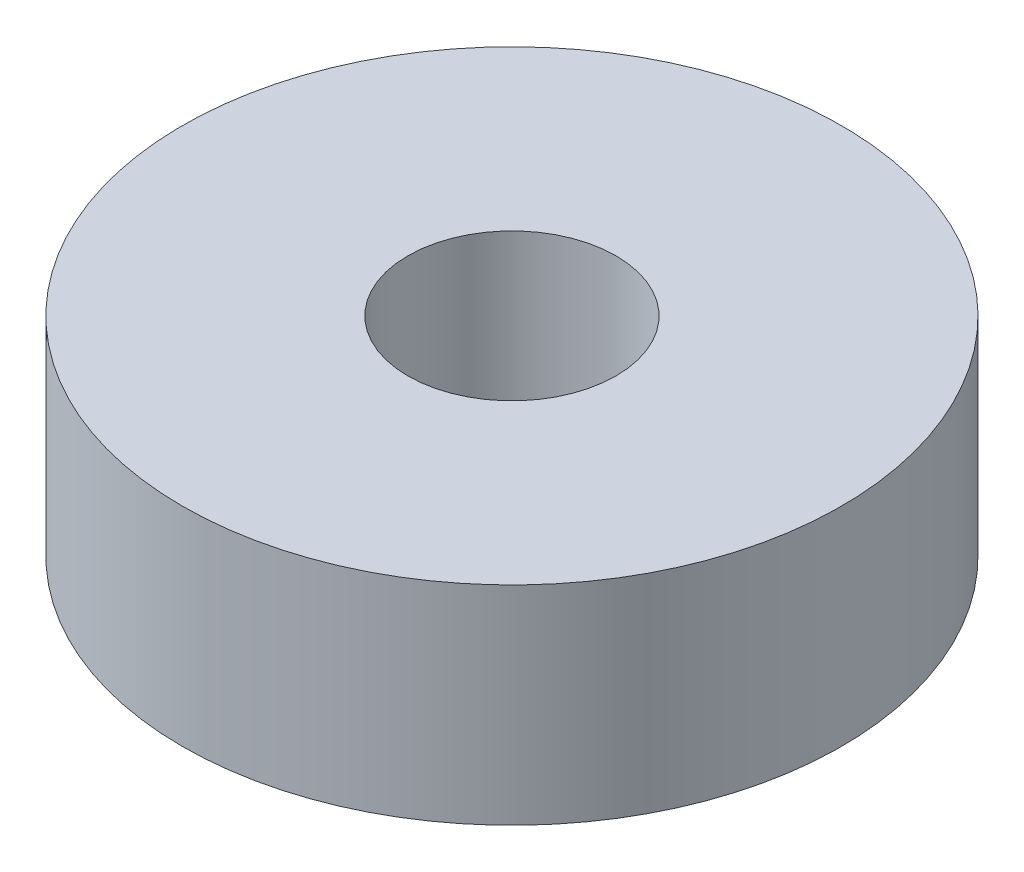
ISO-10303-21;
HEADER;
FILE_DESCRIPTION(('STEP AP214'),'2;1');
FILE_NAME('part.step','',(''),(''),'','','');
FILE_SCHEMA(('AUTOMOTIVE_DESIGN { 1 0 10303 214 1 1 1 1 }'));
ENDSEC;
DATA;
#1=APPLICATION_CONTEXT('core data for automotive mechanical design processes');
#2=APPLICATION_PROTOCOL_DEFINITION('international standard','automotive_design',2000,#1);
#3=PRODUCT_CONTEXT('',#1,'mechanical');
#4=PRODUCT('Part','Part','',(#3));
#5=PRODUCT_RELATED_PRODUCT_CATEGORY('part','',(#4));
#6=PRODUCT_DEFINITION_FORMATION('','',#4);
#7=PRODUCT_DEFINITION_CONTEXT('part definition',#1,'design');
#8=PRODUCT_DEFINITION('design','',#6,#7);
#9=PRODUCT_DEFINITION_SHAPE('','',#8);
#10=(LENGTH_UNIT() NAMED_UNIT(*) SI_UNIT(.MILLI.,.METRE.));
#11=(NAMED_UNIT(*) PLANE_ANGLE_UNIT() SI_UNIT($,.RADIAN.));
#12=(NAMED_UNIT(*) SI_UNIT($,.STERADIAN.) SOLID_ANGLE_UNIT());
#13=UNCERTAINTY_MEASURE_WITH_UNIT(LENGTH_MEASURE(1.E-05),#10,'distance_accuracy_value','');
#14=(GEOMETRIC_REPRESENTATION_CONTEXT(3) GLOBAL_UNCERTAINTY_ASSIGNED_CONTEXT((#13)) GLOBAL_UNIT_ASSIGNED_CONTEXT((#10,
#11,#12)) REPRESENTATION_CONTEXT('',''));
#15=CARTESIAN_POINT('',(0.,0.,0.));
#16=DIRECTION('',(0.,0.,1.));
#17=DIRECTION('',(1.,0.,0.));
#18=AXIS2_PLACEMENT_3D('',#15,#16,#17);
#19=CARTESIAN_POINT('',(0.,6.,0.));
#20=DIRECTION('',(0.,1.,0.));
#21=DIRECTION('',(0.,0.,1.));
#22=AXIS2_PLACEMENT_3D('',#19,#20,#21);
#23=PLANE('',#22);
#24=CARTESIAN_POINT('',(0.,6.,0.));
#25=DIRECTION('',(0.,1.,0.));
#26=DIRECTION('',(0.,0.,1.));
#27=AXIS2_PLACEMENT_3D('',#24,#25,#26);
#28=CIRCLE('',#27,9.5);
#29=CARTESIAN_POINT('',(0.,6.,9.5));
#30=VERTEX_POINT('',#29);
#31=EDGE_CURVE('E10',#30,#30,#28,.T.);
#32=ORIENTED_EDGE('',*,*,#31,.T.);
#33=EDGE_LOOP('',(#32));
#34=FACE_BOUND('',#33,.T.);
#35=CARTESIAN_POINT('',(0.,6.,0.));
#36=DIRECTION('',(0.,1.,0.));
#37=DIRECTION('',(0.,0.,1.));
#38=AXIS2_PLACEMENT_3D('',#35,#36,#37);
#39=CIRCLE('',#38,3.);
#40=CARTESIAN_POINT('',(0.,6.,3.));
#41=VERTEX_POINT('',#40);
#42=EDGE_CURVE('E43',#41,#41,#39,.T.);
#43=ORIENTED_EDGE('',*,*,#42,.F.);
#44=EDGE_LOOP('',(#43));
#45=FACE_BOUND('',#44,.T.);
#46=ADVANCED_FACE('F32',(#34,#45),#23,.T.);
#47=CARTESIAN_POINT('',(0.,0.,0.));
#48=DIRECTION('',(0.,1.,0.));
#49=DIRECTION('',(0.,0.,1.));
#50=AXIS2_PLACEMENT_3D('',#47,#48,#49);
#51=PLANE('',#50);
#52=CARTESIAN_POINT('',(0.,0.,0.));
#53=DIRECTION('',(0.,1.,0.));
#54=DIRECTION('',(0.,0.,1.));
#55=AXIS2_PLACEMENT_3D('',#52,#53,#54);
#56=CIRCLE('',#55,9.5);
#57=CARTESIAN_POINT('',(0.,0.,9.5));
#58=VERTEX_POINT('',#57);
#59=EDGE_CURVE('E36',#58,#58,#56,.T.);
#60=ORIENTED_EDGE('',*,*,#59,.F.);
#61=EDGE_LOOP('',(#60));
#62=FACE_BOUND('',#61,.T.);
#63=CARTESIAN_POINT('',(0.,0.,0.));
#64=DIRECTION('',(0.,1.,0.));
#65=DIRECTION('',(0.,0.,1.));
#66=AXIS2_PLACEMENT_3D('',#63,#64,#65);
#67=CIRCLE('',#66,3.);
#68=CARTESIAN_POINT('',(0.,0.,3.));
#69=VERTEX_POINT('',#68);
#70=EDGE_CURVE('E45',#69,#69,#67,.T.);
#71=ORIENTED_EDGE('',*,*,#70,.T.);
#72=EDGE_LOOP('',(#71));
#73=FACE_BOUND('',#72,.T.);
#74=ADVANCED_FACE('F55',(#62,#73),#51,.F.);
#75=CARTESIAN_POINT('',(0.,6.,0.));
#76=DIRECTION('',(0.,-1.,0.));
#77=DIRECTION('',(0.,0.,-1.));
#78=AXIS2_PLACEMENT_3D('',#75,#76,#77);
#79=CYLINDRICAL_SURFACE('',#78,9.5);
#80=ORIENTED_EDGE('',*,*,#31,.F.);
#81=EDGE_LOOP('',(#80));
#82=FACE_BOUND('',#81,.T.);
#83=ORIENTED_EDGE('',*,*,#59,.T.);
#84=EDGE_LOOP('',(#83));
#85=FACE_BOUND('',#84,.T.);
#86=ADVANCED_FACE('F34',(#82,#85),#79,.T.);
#87=CARTESIAN_POINT('',(0.,6.,0.));
#88=DIRECTION('',(0.,-1.,0.));
#89=DIRECTION('',(0.,0.,-1.));
#90=AXIS2_PLACEMENT_3D('',#87,#88,#89);
#91=CYLINDRICAL_SURFACE('',#90,3.);
#92=ORIENTED_EDGE('',*,*,#42,.T.);
#93=EDGE_LOOP('',(#92));
#94=FACE_BOUND('',#93,.T.);
#95=ORIENTED_EDGE('',*,*,#70,.F.);
#96=EDGE_LOOP('',(#95));
#97=FACE_BOUND('',#96,.T.);
#98=ADVANCED_FACE('F51',(#94,#97),#91,.F.);
#99=CLOSED_SHELL('',(#46,#74,#86,#98));
#100=MANIFOLD_SOLID_BREP('B2',#99);
#101=ADVANCED_BREP_SHAPE_REPRESENTATION('',(#18,#100),#14);
#102=SHAPE_DEFINITION_REPRESENTATION(#9,#101);
ENDSEC;
END-ISO-10303-21;
